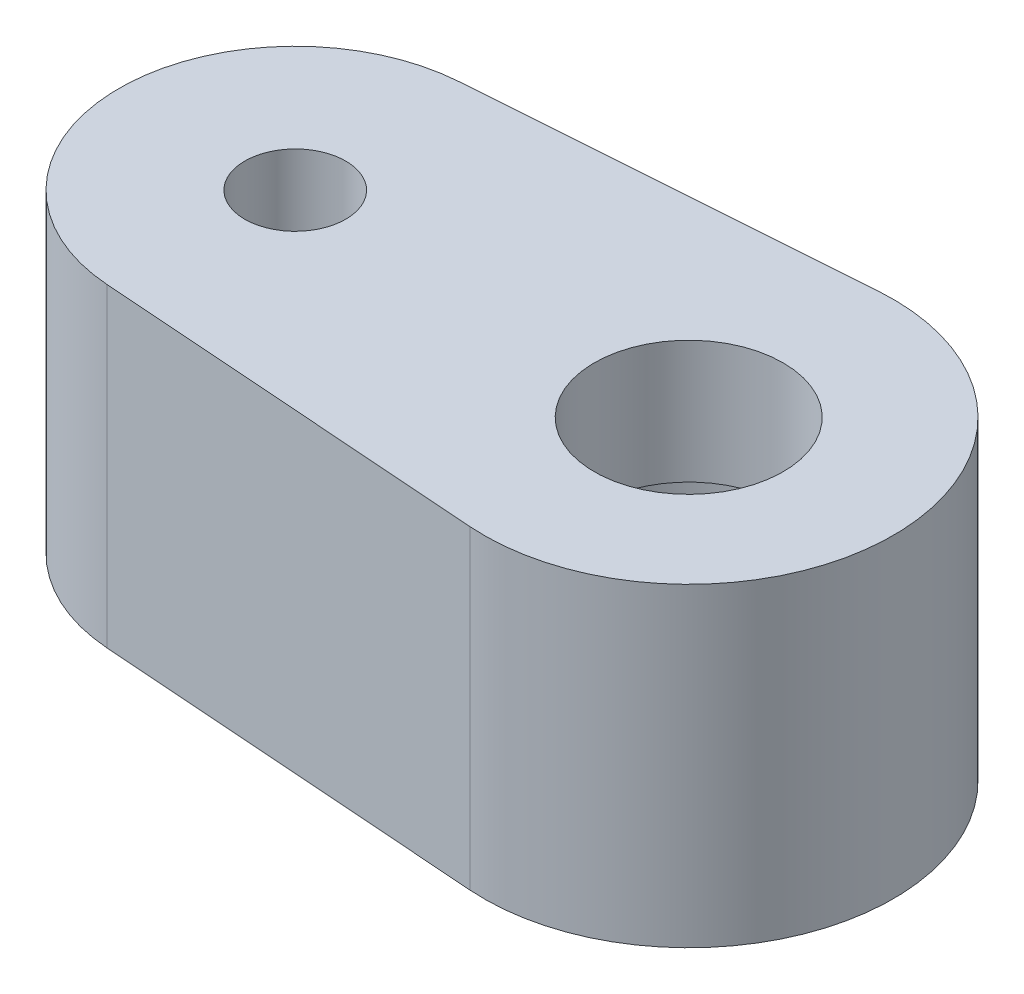
ISO-10303-21;
HEADER;
FILE_DESCRIPTION(('STEP AP214'),'2;1');
FILE_NAME('part.step','',(''),(''),'','','');
FILE_SCHEMA(('AUTOMOTIVE_DESIGN { 1 0 10303 214 1 1 1 1 }'));
ENDSEC;
DATA;
#1=APPLICATION_CONTEXT('core data for automotive mechanical design processes');
#2=APPLICATION_PROTOCOL_DEFINITION('international standard','automotive_design',2000,#1);
#3=PRODUCT_CONTEXT('',#1,'mechanical');
#4=PRODUCT('Part','Part','',(#3));
#5=PRODUCT_RELATED_PRODUCT_CATEGORY('part','',(#4));
#6=PRODUCT_DEFINITION_FORMATION('','',#4);
#7=PRODUCT_DEFINITION_CONTEXT('part definition',#1,'design');
#8=PRODUCT_DEFINITION('design','',#6,#7);
#9=PRODUCT_DEFINITION_SHAPE('','',#8);
#10=(LENGTH_UNIT() NAMED_UNIT(*) SI_UNIT(.MILLI.,.METRE.));
#11=(NAMED_UNIT(*) PLANE_ANGLE_UNIT() SI_UNIT($,.RADIAN.));
#12=(NAMED_UNIT(*) SI_UNIT($,.STERADIAN.) SOLID_ANGLE_UNIT());
#13=UNCERTAINTY_MEASURE_WITH_UNIT(LENGTH_MEASURE(1.E-05),#10,'distance_accuracy_value','');
#14=(GEOMETRIC_REPRESENTATION_CONTEXT(3) GLOBAL_UNCERTAINTY_ASSIGNED_CONTEXT((#13)) GLOBAL_UNIT_ASSIGNED_CONTEXT((#10,
#11,#12)) REPRESENTATION_CONTEXT('',''));
#15=CARTESIAN_POINT('',(0.,0.,0.));
#16=DIRECTION('',(0.,0.,1.));
#17=DIRECTION('',(1.,0.,0.));
#18=AXIS2_PLACEMENT_3D('',#15,#16,#17);
#19=CARTESIAN_POINT('',(-2.5,-1.,0.));
#20=DIRECTION('',(0.,1.,0.));
#21=DIRECTION('',(0.,0.,1.));
#22=AXIS2_PLACEMENT_3D('',#19,#20,#21);
#23=CYLINDRICAL_SURFACE('',#22,1.12);
#24=DIRECTION('',(0.,1.,0.));
#25=VECTOR('',#24,1.);
#26=CARTESIAN_POINT('',(-2.58064,-1.,1.11709318787646));
#27=LINE('',#26,#25);
#28=CARTESIAN_POINT('',(-2.58064,-1.,1.11709318787646));
#29=VERTEX_POINT('',#28);
#30=CARTESIAN_POINT('',(-2.58064,1.,1.11709318787646));
#31=VERTEX_POINT('',#30);
#32=EDGE_CURVE('E36',#29,#31,#27,.T.);
#33=ORIENTED_EDGE('',*,*,#32,.T.);
#34=CARTESIAN_POINT('',(-2.5,1.,0.));
#35=DIRECTION('',(0.,1.,0.));
#36=DIRECTION('',(0.,0.,1.));
#37=AXIS2_PLACEMENT_3D('',#34,#35,#36);
#38=CIRCLE('',#37,1.12);
#39=CARTESIAN_POINT('',(-2.58064,1.,-1.11709318787646));
#40=VERTEX_POINT('',#39);
#41=EDGE_CURVE('E73',#40,#31,#38,.T.);
#42=ORIENTED_EDGE('',*,*,#41,.F.);
#43=DIRECTION('',(0.,1.,0.));
#44=VECTOR('',#43,1.);
#45=CARTESIAN_POINT('',(-2.58064,-1.,-1.11709318787646));
#46=LINE('',#45,#44);
#47=CARTESIAN_POINT('',(-2.58064,-1.,-1.11709318787646));
#48=VERTEX_POINT('',#47);
#49=EDGE_CURVE('E11',#48,#40,#46,.T.);
#50=ORIENTED_EDGE('',*,*,#49,.F.);
#51=CARTESIAN_POINT('',(-2.5,-1.,0.));
#52=DIRECTION('',(0.,1.,0.));
#53=DIRECTION('',(0.,0.,1.));
#54=AXIS2_PLACEMENT_3D('',#51,#52,#53);
#55=CIRCLE('',#54,1.12);
#56=EDGE_CURVE('E74',#48,#29,#55,.T.);
#57=ORIENTED_EDGE('',*,*,#56,.T.);
#58=EDGE_LOOP('',(#33,#42,#50,#57));
#59=FACE_BOUND('',#58,.T.);
#60=ADVANCED_FACE('F33',(#59),#23,.T.);
#61=CARTESIAN_POINT('',(-2.58064,-1.,-1.11709318787646));
#62=DIRECTION('',(-0.0719999999999999,0.,-0.997404632032557));
#63=DIRECTION('',(-0.997404632032557,0.,0.0719999999999999));
#64=AXIS2_PLACEMENT_3D('',#61,#62,#63);
#65=PLANE('',#64);
#66=ORIENTED_EDGE('',*,*,#49,.T.);
#67=DIRECTION('',(-0.997404632032557,0.,0.0719999999999999));
#68=VECTOR('',#67,1.);
#69=CARTESIAN_POINT('',(-2.58064,1.,-1.11709318787646));
#70=LINE('',#69,#68);
#71=CARTESIAN_POINT('',(-0.0935999999999999,1.,-1.29662602164232));
#72=VERTEX_POINT('',#71);
#73=EDGE_CURVE('E90',#72,#40,#70,.T.);
#74=ORIENTED_EDGE('',*,*,#73,.F.);
#75=DIRECTION('',(0.,1.,0.));
#76=VECTOR('',#75,1.);
#77=CARTESIAN_POINT('',(-0.0935999999999999,-1.,-1.29662602164232));
#78=LINE('',#77,#76);
#79=CARTESIAN_POINT('',(-0.0935999999999999,-1.,-1.29662602164232));
#80=VERTEX_POINT('',#79);
#81=EDGE_CURVE('E41',#80,#72,#78,.T.);
#82=ORIENTED_EDGE('',*,*,#81,.F.);
#83=DIRECTION('',(-0.997404632032557,0.,0.0719999999999999));
#84=VECTOR('',#83,1.);
#85=CARTESIAN_POINT('',(-2.58064,-1.,-1.11709318787646));
#86=LINE('',#85,#84);
#87=EDGE_CURVE('E79',#80,#48,#86,.T.);
#88=ORIENTED_EDGE('',*,*,#87,.T.);
#89=EDGE_LOOP('',(#66,#74,#82,#88));
#90=FACE_BOUND('',#89,.T.);
#91=ADVANCED_FACE('F110',(#90),#65,.T.);
#92=CARTESIAN_POINT('',(0.,-1.,0.));
#93=DIRECTION('',(0.,1.,0.));
#94=DIRECTION('',(0.,0.,1.));
#95=AXIS2_PLACEMENT_3D('',#92,#93,#94);
#96=CYLINDRICAL_SURFACE('',#95,1.3);
#97=ORIENTED_EDGE('',*,*,#81,.T.);
#98=CARTESIAN_POINT('',(0.,1.,0.));
#99=DIRECTION('',(0.,1.,0.));
#100=DIRECTION('',(0.,0.,1.));
#101=AXIS2_PLACEMENT_3D('',#98,#99,#100);
#102=CIRCLE('',#101,1.3);
#103=CARTESIAN_POINT('',(-0.0935999999999997,1.,1.29662602164232));
#104=VERTEX_POINT('',#103);
#105=EDGE_CURVE('E86',#104,#72,#102,.T.);
#106=ORIENTED_EDGE('',*,*,#105,.F.);
#107=DIRECTION('',(0.,1.,0.));
#108=VECTOR('',#107,1.);
#109=CARTESIAN_POINT('',(-0.0935999999999997,-1.,1.29662602164232));
#110=LINE('',#109,#108);
#111=CARTESIAN_POINT('',(-0.0935999999999997,-1.,1.29662602164232));
#112=VERTEX_POINT('',#111);
#113=EDGE_CURVE('E78',#112,#104,#110,.T.);
#114=ORIENTED_EDGE('',*,*,#113,.F.);
#115=CARTESIAN_POINT('',(0.,-1.,0.));
#116=DIRECTION('',(0.,1.,0.));
#117=DIRECTION('',(0.,0.,1.));
#118=AXIS2_PLACEMENT_3D('',#115,#116,#117);
#119=CIRCLE('',#118,1.3);
#120=EDGE_CURVE('E103',#112,#80,#119,.T.);
#121=ORIENTED_EDGE('',*,*,#120,.T.);
#122=EDGE_LOOP('',(#97,#106,#114,#121));
#123=FACE_BOUND('',#122,.T.);
#124=ADVANCED_FACE('F107',(#123),#96,.T.);
#125=CARTESIAN_POINT('',(-2.58064,-1.,1.11709318787646));
#126=DIRECTION('',(-0.0720000000000001,0.,0.997404632032557));
#127=DIRECTION('',(0.997404632032557,0.,0.0720000000000001));
#128=AXIS2_PLACEMENT_3D('',#125,#126,#127);
#129=PLANE('',#128);
#130=ORIENTED_EDGE('',*,*,#113,.T.);
#131=DIRECTION('',(0.997404632032557,0.,0.0720000000000001));
#132=VECTOR('',#131,1.);
#133=CARTESIAN_POINT('',(-2.58064,1.,1.11709318787646));
#134=LINE('',#133,#132);
#135=EDGE_CURVE('E81',#31,#104,#134,.T.);
#136=ORIENTED_EDGE('',*,*,#135,.F.);
#137=ORIENTED_EDGE('',*,*,#32,.F.);
#138=DIRECTION('',(0.997404632032557,0.,0.0720000000000001));
#139=VECTOR('',#138,1.);
#140=CARTESIAN_POINT('',(-2.58064,-1.,1.11709318787646));
#141=LINE('',#140,#139);
#142=EDGE_CURVE('E101',#29,#112,#141,.T.);
#143=ORIENTED_EDGE('',*,*,#142,.T.);
#144=EDGE_LOOP('',(#130,#136,#137,#143));
#145=FACE_BOUND('',#144,.T.);
#146=ADVANCED_FACE('F82',(#145),#129,.T.);
#147=CARTESIAN_POINT('',(-2.5,-1.,0.));
#148=DIRECTION('',(0.,1.,0.));
#149=DIRECTION('',(0.,0.,1.));
#150=AXIS2_PLACEMENT_3D('',#147,#148,#149);
#151=PLANE('',#150);
#152=CARTESIAN_POINT('',(-2.5,-1.,0.));
#153=DIRECTION('',(0.,1.,0.));
#154=DIRECTION('',(0.,0.,1.));
#155=AXIS2_PLACEMENT_3D('',#152,#153,#154);
#156=CIRCLE('',#155,0.3207);
#157=CARTESIAN_POINT('',(-2.5,-1.,0.3207));
#158=VERTEX_POINT('',#157);
#159=EDGE_CURVE('E219',#158,#158,#156,.F.);
#160=ORIENTED_EDGE('',*,*,#159,.F.);
#161=EDGE_LOOP('',(#160));
#162=FACE_BOUND('',#161,.T.);
#163=CARTESIAN_POINT('',(0.,-1.,0.));
#164=DIRECTION('',(0.,-1.,0.));
#165=DIRECTION('',(0.,0.,-1.));
#166=AXIS2_PLACEMENT_3D('',#163,#164,#165);
#167=CIRCLE('',#166,0.6);
#168=CARTESIAN_POINT('',(0.,-1.,-0.6));
#169=VERTEX_POINT('',#168);
#170=EDGE_CURVE('E229',#169,#169,#167,.T.);
#171=ORIENTED_EDGE('',*,*,#170,.F.);
#172=EDGE_LOOP('',(#171));
#173=FACE_BOUND('',#172,.T.);
#174=ORIENTED_EDGE('',*,*,#56,.F.);
#175=ORIENTED_EDGE('',*,*,#87,.F.);
#176=ORIENTED_EDGE('',*,*,#120,.F.);
#177=ORIENTED_EDGE('',*,*,#142,.F.);
#178=EDGE_LOOP('',(#174,#175,#176,#177));
#179=FACE_BOUND('',#178,.T.);
#180=ADVANCED_FACE('F112',(#162,#173,#179),#151,.F.);
#181=CARTESIAN_POINT('',(-2.5,1.,0.));
#182=DIRECTION('',(0.,1.,0.));
#183=DIRECTION('',(0.,0.,1.));
#184=AXIS2_PLACEMENT_3D('',#181,#182,#183);
#185=PLANE('',#184);
#186=CARTESIAN_POINT('',(-2.5,1.,0.));
#187=DIRECTION('',(0.,1.,0.));
#188=DIRECTION('',(0.,0.,1.));
#189=AXIS2_PLACEMENT_3D('',#186,#187,#188);
#190=CIRCLE('',#189,0.3207);
#191=CARTESIAN_POINT('',(-2.5,1.,0.3207));
#192=VERTEX_POINT('',#191);
#193=EDGE_CURVE('E217',#192,#192,#190,.T.);
#194=ORIENTED_EDGE('',*,*,#193,.F.);
#195=EDGE_LOOP('',(#194));
#196=FACE_BOUND('',#195,.T.);
#197=CARTESIAN_POINT('',(0.,1.,0.));
#198=DIRECTION('',(0.,-1.,0.));
#199=DIRECTION('',(0.,0.,-1.));
#200=AXIS2_PLACEMENT_3D('',#197,#198,#199);
#201=CIRCLE('',#200,0.6);
#202=CARTESIAN_POINT('',(0.,1.,-0.6));
#203=VERTEX_POINT('',#202);
#204=EDGE_CURVE('E232',#203,#203,#201,.T.);
#205=ORIENTED_EDGE('',*,*,#204,.T.);
#206=EDGE_LOOP('',(#205));
#207=FACE_BOUND('',#206,.T.);
#208=ORIENTED_EDGE('',*,*,#41,.T.);
#209=ORIENTED_EDGE('',*,*,#135,.T.);
#210=ORIENTED_EDGE('',*,*,#105,.T.);
#211=ORIENTED_EDGE('',*,*,#73,.T.);
#212=EDGE_LOOP('',(#208,#209,#210,#211));
#213=FACE_BOUND('',#212,.T.);
#214=ADVANCED_FACE('F89',(#196,#207,#213),#185,.T.);
#215=CARTESIAN_POINT('',(0.,-1.,0.));
#216=DIRECTION('',(0.,-1.,0.));
#217=DIRECTION('',(0.,0.,-1.));
#218=AXIS2_PLACEMENT_3D('',#215,#216,#217);
#219=CYLINDRICAL_SURFACE('',#218,0.85);
#220=CARTESIAN_POINT('',(0.,0.075,0.));
#221=DIRECTION('',(0.,-1.,0.));
#222=DIRECTION('',(0.,0.,-1.));
#223=AXIS2_PLACEMENT_3D('',#220,#221,#222);
#224=CIRCLE('',#223,0.85);
#225=CARTESIAN_POINT('',(0.,0.075,-0.85));
#226=VERTEX_POINT('',#225);
#227=EDGE_CURVE('E91',#226,#226,#224,.T.);
#228=ORIENTED_EDGE('',*,*,#227,.F.);
#229=EDGE_LOOP('',(#228));
#230=FACE_BOUND('',#229,.T.);
#231=CARTESIAN_POINT('',(0.,-0.075,0.));
#232=DIRECTION('',(0.,-1.,0.));
#233=DIRECTION('',(0.,0.,-1.));
#234=AXIS2_PLACEMENT_3D('',#231,#232,#233);
#235=CIRCLE('',#234,0.85);
#236=CARTESIAN_POINT('',(0.,-0.075,-0.85));
#237=VERTEX_POINT('',#236);
#238=EDGE_CURVE('E220',#237,#237,#235,.T.);
#239=ORIENTED_EDGE('',*,*,#238,.T.);
#240=EDGE_LOOP('',(#239));
#241=FACE_BOUND('',#240,.T.);
#242=ADVANCED_FACE('F120',(#230,#241),#219,.F.);
#243=CARTESIAN_POINT('',(0.,0.075,0.));
#244=DIRECTION('',(0.,-1.,0.));
#245=DIRECTION('',(0.,0.,-1.));
#246=AXIS2_PLACEMENT_3D('',#243,#244,#245);
#247=CONICAL_SURFACE('',#246,0.85,1.0471975511966);
#248=CARTESIAN_POINT('',(0.,0.219337567297406,0.));
#249=DIRECTION('',(0.,-1.,0.));
#250=DIRECTION('',(0.,0.,-1.));
#251=AXIS2_PLACEMENT_3D('',#248,#249,#250);
#252=CIRCLE('',#251,0.6);
#253=CARTESIAN_POINT('',(0.,0.219337567297406,-0.6));
#254=VERTEX_POINT('',#253);
#255=EDGE_CURVE('E94',#254,#254,#252,.T.);
#256=ORIENTED_EDGE('',*,*,#255,.F.);
#257=EDGE_LOOP('',(#256));
#258=FACE_BOUND('',#257,.T.);
#259=ORIENTED_EDGE('',*,*,#227,.T.);
#260=EDGE_LOOP('',(#259));
#261=FACE_BOUND('',#260,.T.);
#262=ADVANCED_FACE('F150',(#258,#261),#247,.F.);
#263=CARTESIAN_POINT('',(0.,-1.,0.));
#264=DIRECTION('',(0.,-1.,0.));
#265=DIRECTION('',(0.,0.,-1.));
#266=AXIS2_PLACEMENT_3D('',#263,#264,#265);
#267=CYLINDRICAL_SURFACE('',#266,0.6);
#268=ORIENTED_EDGE('',*,*,#204,.F.);
#269=EDGE_LOOP('',(#268));
#270=FACE_BOUND('',#269,.T.);
#271=ORIENTED_EDGE('',*,*,#255,.T.);
#272=EDGE_LOOP('',(#271));
#273=FACE_BOUND('',#272,.T.);
#274=ADVANCED_FACE('F161',(#270,#273),#267,.F.);
#275=CARTESIAN_POINT('',(0.,-1.,0.));
#276=DIRECTION('',(0.,-1.,0.));
#277=DIRECTION('',(0.,0.,-1.));
#278=AXIS2_PLACEMENT_3D('',#275,#276,#277);
#279=CYLINDRICAL_SURFACE('',#278,0.6);
#280=CARTESIAN_POINT('',(0.,-0.219337567297406,0.));
#281=DIRECTION('',(0.,-1.,0.));
#282=DIRECTION('',(0.,0.,-1.));
#283=AXIS2_PLACEMENT_3D('',#280,#281,#282);
#284=CIRCLE('',#283,0.6);
#285=CARTESIAN_POINT('',(0.,-0.219337567297406,-0.6));
#286=VERTEX_POINT('',#285);
#287=EDGE_CURVE('E223',#286,#286,#284,.T.);
#288=ORIENTED_EDGE('',*,*,#287,.F.);
#289=EDGE_LOOP('',(#288));
#290=FACE_BOUND('',#289,.T.);
#291=ORIENTED_EDGE('',*,*,#170,.T.);
#292=EDGE_LOOP('',(#291));
#293=FACE_BOUND('',#292,.T.);
#294=ADVANCED_FACE('F171',(#290,#293),#279,.F.);
#295=CARTESIAN_POINT('',(0.,-0.219337567297406,0.));
#296=DIRECTION('',(0.,1.,0.));
#297=DIRECTION('',(0.,0.,1.));
#298=AXIS2_PLACEMENT_3D('',#295,#296,#297);
#299=CONICAL_SURFACE('',#298,0.6,1.0471975511966);
#300=ORIENTED_EDGE('',*,*,#238,.F.);
#301=EDGE_LOOP('',(#300));
#302=FACE_BOUND('',#301,.T.);
#303=ORIENTED_EDGE('',*,*,#287,.T.);
#304=EDGE_LOOP('',(#303));
#305=FACE_BOUND('',#304,.T.);
#306=ADVANCED_FACE('F181',(#302,#305),#299,.F.);
#307=CARTESIAN_POINT('',(-2.5,-1.001,0.));
#308=DIRECTION('',(0.,1.,0.));
#309=DIRECTION('',(0.,0.,1.));
#310=AXIS2_PLACEMENT_3D('',#307,#308,#309);
#311=CYLINDRICAL_SURFACE('',#310,0.3207);
#312=ORIENTED_EDGE('',*,*,#193,.T.);
#313=EDGE_LOOP('',(#312));
#314=FACE_BOUND('',#313,.T.);
#315=ORIENTED_EDGE('',*,*,#159,.T.);
#316=EDGE_LOOP('',(#315));
#317=FACE_BOUND('',#316,.T.);
#318=ADVANCED_FACE('F190',(#314,#317),#311,.F.);
#319=CLOSED_SHELL('',(#60,#91,#124,#146,#180,#214,#242,#262,#274,#294,#306,#318));
#320=MANIFOLD_SOLID_BREP('B2',#319);
#321=ADVANCED_BREP_SHAPE_REPRESENTATION('',(#18,#320),#14);
#322=SHAPE_DEFINITION_REPRESENTATION(#9,#321);
ENDSEC;
END-ISO-10303-21;
